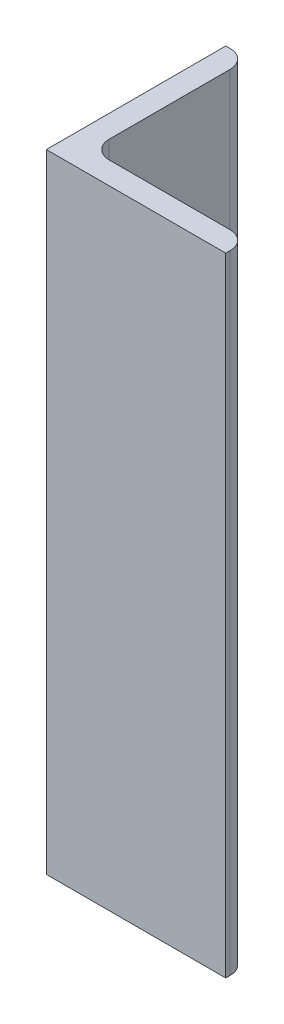
ISO-10303-21;
HEADER;
FILE_DESCRIPTION(('STEP AP214'),'2;1');
FILE_NAME('part.step','',(''),(''),'','','');
FILE_SCHEMA(('AUTOMOTIVE_DESIGN { 1 0 10303 214 1 1 1 1 }'));
ENDSEC;
DATA;
#1=APPLICATION_CONTEXT('core data for automotive mechanical design processes');
#2=APPLICATION_PROTOCOL_DEFINITION('international standard','automotive_design',2000,#1);
#3=PRODUCT_CONTEXT('',#1,'mechanical');
#4=PRODUCT('Part','Part','',(#3));
#5=PRODUCT_RELATED_PRODUCT_CATEGORY('part','',(#4));
#6=PRODUCT_DEFINITION_FORMATION('','',#4);
#7=PRODUCT_DEFINITION_CONTEXT('part definition',#1,'design');
#8=PRODUCT_DEFINITION('design','',#6,#7);
#9=PRODUCT_DEFINITION_SHAPE('','',#8);
#10=(LENGTH_UNIT() NAMED_UNIT(*) SI_UNIT(.MILLI.,.METRE.));
#11=(NAMED_UNIT(*) PLANE_ANGLE_UNIT() SI_UNIT($,.RADIAN.));
#12=(NAMED_UNIT(*) SI_UNIT($,.STERADIAN.) SOLID_ANGLE_UNIT());
#13=UNCERTAINTY_MEASURE_WITH_UNIT(LENGTH_MEASURE(1.E-05),#10,'distance_accuracy_value','');
#14=(GEOMETRIC_REPRESENTATION_CONTEXT(3) GLOBAL_UNCERTAINTY_ASSIGNED_CONTEXT((#13)) GLOBAL_UNIT_ASSIGNED_CONTEXT((#10,
#11,#12)) REPRESENTATION_CONTEXT('',''));
#15=CARTESIAN_POINT('',(0.,0.,0.));
#16=DIRECTION('',(0.,0.,1.));
#17=DIRECTION('',(1.,0.,0.));
#18=AXIS2_PLACEMENT_3D('',#15,#16,#17);
#19=CARTESIAN_POINT('',(25.4,88.9,0.));
#20=DIRECTION('',(0.,0.,-1.));
#21=DIRECTION('',(-1.,0.,0.));
#22=AXIS2_PLACEMENT_3D('',#19,#20,#21);
#23=PLANE('',#22);
#24=DIRECTION('',(1.,0.,0.));
#25=VECTOR('',#24,1.);
#26=CARTESIAN_POINT('',(25.4,0.,0.));
#27=LINE('',#26,#25);
#28=CARTESIAN_POINT('',(0.,0.,0.));
#29=VERTEX_POINT('',#28);
#30=CARTESIAN_POINT('',(25.4,0.,0.));
#31=VERTEX_POINT('',#30);
#32=EDGE_CURVE('E164',#29,#31,#27,.T.);
#33=ORIENTED_EDGE('',*,*,#32,.T.);
#34=DIRECTION('',(0.,-1.,0.));
#35=VECTOR('',#34,1.);
#36=CARTESIAN_POINT('',(25.4,88.9,0.));
#37=LINE('',#36,#35);
#38=CARTESIAN_POINT('',(25.4,88.9,0.));
#39=VERTEX_POINT('',#38);
#40=EDGE_CURVE('E11',#39,#31,#37,.T.);
#41=ORIENTED_EDGE('',*,*,#40,.F.);
#42=DIRECTION('',(1.,0.,0.));
#43=VECTOR('',#42,1.);
#44=CARTESIAN_POINT('',(25.4,88.9,0.));
#45=LINE('',#44,#43);
#46=CARTESIAN_POINT('',(0.,88.9,0.));
#47=VERTEX_POINT('',#46);
#48=EDGE_CURVE('E189',#47,#39,#45,.T.);
#49=ORIENTED_EDGE('',*,*,#48,.F.);
#50=DIRECTION('',(0.,-1.,0.));
#51=VECTOR('',#50,1.);
#52=CARTESIAN_POINT('',(0.,88.9,0.));
#53=LINE('',#52,#51);
#54=EDGE_CURVE('E160',#47,#29,#53,.T.);
#55=ORIENTED_EDGE('',*,*,#54,.T.);
#56=EDGE_LOOP('',(#33,#41,#49,#55));
#57=FACE_BOUND('',#56,.T.);
#58=ADVANCED_FACE('F45',(#57),#23,.F.);
#59=CARTESIAN_POINT('',(25.4,88.9,-0.634999999999982));
#60=DIRECTION('',(-1.,0.,0.));
#61=DIRECTION('',(0.,0.,1.));
#62=AXIS2_PLACEMENT_3D('',#59,#60,#61);
#63=PLANE('',#62);
#64=DIRECTION('',(0.,0.,-1.));
#65=VECTOR('',#64,1.);
#66=CARTESIAN_POINT('',(25.4,0.,-0.634999999999982));
#67=LINE('',#66,#65);
#68=CARTESIAN_POINT('',(25.4,0.,-0.634999999999982));
#69=VERTEX_POINT('',#68);
#70=EDGE_CURVE('E168',#31,#69,#67,.T.);
#71=ORIENTED_EDGE('',*,*,#70,.T.);
#72=DIRECTION('',(0.,-1.,0.));
#73=VECTOR('',#72,1.);
#74=CARTESIAN_POINT('',(25.4,88.9,-0.634999999999982));
#75=LINE('',#74,#73);
#76=CARTESIAN_POINT('',(25.4,88.9,-0.634999999999982));
#77=VERTEX_POINT('',#76);
#78=EDGE_CURVE('E54',#77,#69,#75,.T.);
#79=ORIENTED_EDGE('',*,*,#78,.F.);
#80=DIRECTION('',(0.,0.,-1.));
#81=VECTOR('',#80,1.);
#82=CARTESIAN_POINT('',(25.4,88.9,-0.634999999999982));
#83=LINE('',#82,#81);
#84=EDGE_CURVE('E122',#39,#77,#83,.T.);
#85=ORIENTED_EDGE('',*,*,#84,.F.);
#86=ORIENTED_EDGE('',*,*,#40,.T.);
#87=EDGE_LOOP('',(#71,#79,#85,#86));
#88=FACE_BOUND('',#87,.T.);
#89=ADVANCED_FACE('F245',(#88),#63,.F.);
#90=CARTESIAN_POINT('',(22.86,88.9,-0.635));
#91=DIRECTION('',(0.,-1.,0.));
#92=DIRECTION('',(0.,0.,-1.));
#93=AXIS2_PLACEMENT_3D('',#90,#91,#92);
#94=CYLINDRICAL_SURFACE('',#93,2.54);
#95=CARTESIAN_POINT('',(22.86,0.,-0.635));
#96=DIRECTION('',(0.,1.,0.));
#97=DIRECTION('',(0.,0.,-1.));
#98=AXIS2_PLACEMENT_3D('',#95,#96,#97);
#99=CIRCLE('',#98,2.54);
#100=CARTESIAN_POINT('',(22.86,0.,-3.175));
#101=VERTEX_POINT('',#100);
#102=EDGE_CURVE('E171',#69,#101,#99,.T.);
#103=ORIENTED_EDGE('',*,*,#102,.T.);
#104=DIRECTION('',(0.,-1.,0.));
#105=VECTOR('',#104,1.);
#106=CARTESIAN_POINT('',(22.86,88.9,-3.175));
#107=LINE('',#106,#105);
#108=CARTESIAN_POINT('',(22.86,88.9,-3.175));
#109=VERTEX_POINT('',#108);
#110=EDGE_CURVE('E204',#109,#101,#107,.T.);
#111=ORIENTED_EDGE('',*,*,#110,.F.);
#112=CARTESIAN_POINT('',(22.86,88.9,-0.635));
#113=DIRECTION('',(0.,1.,0.));
#114=DIRECTION('',(0.,0.,-1.));
#115=AXIS2_PLACEMENT_3D('',#112,#113,#114);
#116=CIRCLE('',#115,2.54);
#117=EDGE_CURVE('E214',#77,#109,#116,.T.);
#118=ORIENTED_EDGE('',*,*,#117,.F.);
#119=ORIENTED_EDGE('',*,*,#78,.T.);
#120=EDGE_LOOP('',(#103,#111,#118,#119));
#121=FACE_BOUND('',#120,.T.);
#122=ADVANCED_FACE('F212',(#121),#94,.T.);
#123=CARTESIAN_POINT('',(5.71500000000002,88.9,-3.175));
#124=DIRECTION('',(0.,0.,1.));
#125=DIRECTION('',(1.,0.,0.));
#126=AXIS2_PLACEMENT_3D('',#123,#124,#125);
#127=PLANE('',#126);
#128=DIRECTION('',(-1.,0.,0.));
#129=VECTOR('',#128,1.);
#130=CARTESIAN_POINT('',(5.71500000000002,0.,-3.175));
#131=LINE('',#130,#129);
#132=CARTESIAN_POINT('',(5.71500000000002,0.,-3.175));
#133=VERTEX_POINT('',#132);
#134=EDGE_CURVE('E174',#101,#133,#131,.T.);
#135=ORIENTED_EDGE('',*,*,#134,.T.);
#136=DIRECTION('',(0.,-1.,0.));
#137=VECTOR('',#136,1.);
#138=CARTESIAN_POINT('',(5.71500000000002,88.9,-3.175));
#139=LINE('',#138,#137);
#140=CARTESIAN_POINT('',(5.71500000000002,88.9,-3.175));
#141=VERTEX_POINT('',#140);
#142=EDGE_CURVE('E200',#141,#133,#139,.T.);
#143=ORIENTED_EDGE('',*,*,#142,.F.);
#144=DIRECTION('',(-1.,0.,0.));
#145=VECTOR('',#144,1.);
#146=CARTESIAN_POINT('',(5.71500000000002,88.9,-3.175));
#147=LINE('',#146,#145);
#148=EDGE_CURVE('E231',#109,#141,#147,.T.);
#149=ORIENTED_EDGE('',*,*,#148,.F.);
#150=ORIENTED_EDGE('',*,*,#110,.T.);
#151=EDGE_LOOP('',(#135,#143,#149,#150));
#152=FACE_BOUND('',#151,.T.);
#153=ADVANCED_FACE('F223',(#152),#127,.F.);
#154=CARTESIAN_POINT('',(5.715,88.9,-5.715));
#155=DIRECTION('',(0.,-1.,0.));
#156=DIRECTION('',(0.,0.,-1.));
#157=AXIS2_PLACEMENT_3D('',#154,#155,#156);
#158=CYLINDRICAL_SURFACE('',#157,2.54);
#159=CARTESIAN_POINT('',(5.715,0.,-5.715));
#160=DIRECTION('',(0.,-1.,0.));
#161=DIRECTION('',(0.,0.,1.));
#162=AXIS2_PLACEMENT_3D('',#159,#160,#161);
#163=CIRCLE('',#162,2.54);
#164=CARTESIAN_POINT('',(3.175,0.,-5.71500000000002));
#165=VERTEX_POINT('',#164);
#166=EDGE_CURVE('E177',#133,#165,#163,.T.);
#167=ORIENTED_EDGE('',*,*,#166,.T.);
#168=DIRECTION('',(0.,-1.,0.));
#169=VECTOR('',#168,1.);
#170=CARTESIAN_POINT('',(3.175,88.9,-5.71500000000002));
#171=LINE('',#170,#169);
#172=CARTESIAN_POINT('',(3.175,88.9,-5.71500000000002));
#173=VERTEX_POINT('',#172);
#174=EDGE_CURVE('E196',#173,#165,#171,.T.);
#175=ORIENTED_EDGE('',*,*,#174,.F.);
#176=CARTESIAN_POINT('',(5.715,88.9,-5.715));
#177=DIRECTION('',(0.,-1.,0.));
#178=DIRECTION('',(0.,0.,1.));
#179=AXIS2_PLACEMENT_3D('',#176,#177,#178);
#180=CIRCLE('',#179,2.54);
#181=EDGE_CURVE('E229',#141,#173,#180,.T.);
#182=ORIENTED_EDGE('',*,*,#181,.F.);
#183=ORIENTED_EDGE('',*,*,#142,.T.);
#184=EDGE_LOOP('',(#167,#175,#182,#183));
#185=FACE_BOUND('',#184,.T.);
#186=ADVANCED_FACE('F227',(#185),#158,.F.);
#187=CARTESIAN_POINT('',(3.175,88.9,-22.86));
#188=DIRECTION('',(-1.,0.,0.));
#189=DIRECTION('',(0.,0.,1.));
#190=AXIS2_PLACEMENT_3D('',#187,#188,#189);
#191=PLANE('',#190);
#192=DIRECTION('',(0.,0.,-1.));
#193=VECTOR('',#192,1.);
#194=CARTESIAN_POINT('',(3.175,0.,-22.86));
#195=LINE('',#194,#193);
#196=CARTESIAN_POINT('',(3.175,0.,-22.86));
#197=VERTEX_POINT('',#196);
#198=EDGE_CURVE('E180',#165,#197,#195,.T.);
#199=ORIENTED_EDGE('',*,*,#198,.T.);
#200=DIRECTION('',(0.,-1.,0.));
#201=VECTOR('',#200,1.);
#202=CARTESIAN_POINT('',(3.175,88.9,-22.86));
#203=LINE('',#202,#201);
#204=CARTESIAN_POINT('',(3.175,88.9,-22.86));
#205=VERTEX_POINT('',#204);
#206=EDGE_CURVE('E154',#205,#197,#203,.T.);
#207=ORIENTED_EDGE('',*,*,#206,.F.);
#208=DIRECTION('',(0.,0.,-1.));
#209=VECTOR('',#208,1.);
#210=CARTESIAN_POINT('',(3.175,88.9,-22.86));
#211=LINE('',#210,#209);
#212=EDGE_CURVE('E144',#173,#205,#211,.T.);
#213=ORIENTED_EDGE('',*,*,#212,.F.);
#214=ORIENTED_EDGE('',*,*,#174,.T.);
#215=EDGE_LOOP('',(#199,#207,#213,#214));
#216=FACE_BOUND('',#215,.T.);
#217=ADVANCED_FACE('F257',(#216),#191,.F.);
#218=CARTESIAN_POINT('',(0.635,88.9,-22.86));
#219=DIRECTION('',(0.,-1.,0.));
#220=DIRECTION('',(0.,0.,-1.));
#221=AXIS2_PLACEMENT_3D('',#218,#219,#220);
#222=CYLINDRICAL_SURFACE('',#221,2.54);
#223=CARTESIAN_POINT('',(0.635,0.,-22.86));
#224=DIRECTION('',(0.,1.,0.));
#225=DIRECTION('',(0.,0.,-1.));
#226=AXIS2_PLACEMENT_3D('',#223,#224,#225);
#227=CIRCLE('',#226,2.54);
#228=CARTESIAN_POINT('',(0.634999999999982,0.,-25.4));
#229=VERTEX_POINT('',#228);
#230=EDGE_CURVE('E152',#197,#229,#227,.T.);
#231=ORIENTED_EDGE('',*,*,#230,.T.);
#232=DIRECTION('',(0.,-1.,0.));
#233=VECTOR('',#232,1.);
#234=CARTESIAN_POINT('',(0.634999999999982,88.9,-25.4));
#235=LINE('',#234,#233);
#236=CARTESIAN_POINT('',(0.634999999999982,88.9,-25.4));
#237=VERTEX_POINT('',#236);
#238=EDGE_CURVE('E149',#237,#229,#235,.T.);
#239=ORIENTED_EDGE('',*,*,#238,.F.);
#240=CARTESIAN_POINT('',(0.635,88.9,-22.86));
#241=DIRECTION('',(0.,1.,0.));
#242=DIRECTION('',(0.,0.,-1.));
#243=AXIS2_PLACEMENT_3D('',#240,#241,#242);
#244=CIRCLE('',#243,2.54);
#245=EDGE_CURVE('E138',#205,#237,#244,.T.);
#246=ORIENTED_EDGE('',*,*,#245,.F.);
#247=ORIENTED_EDGE('',*,*,#206,.T.);
#248=EDGE_LOOP('',(#231,#239,#246,#247));
#249=FACE_BOUND('',#248,.T.);
#250=ADVANCED_FACE('F150',(#249),#222,.T.);
#251=CARTESIAN_POINT('',(0.,88.9,-25.4));
#252=DIRECTION('',(0.,0.,1.));
#253=DIRECTION('',(1.,0.,0.));
#254=AXIS2_PLACEMENT_3D('',#251,#252,#253);
#255=PLANE('',#254);
#256=DIRECTION('',(-1.,0.,0.));
#257=VECTOR('',#256,1.);
#258=CARTESIAN_POINT('',(0.,0.,-25.4));
#259=LINE('',#258,#257);
#260=CARTESIAN_POINT('',(0.,0.,-25.4));
#261=VERTEX_POINT('',#260);
#262=EDGE_CURVE('E105',#229,#261,#259,.T.);
#263=ORIENTED_EDGE('',*,*,#262,.T.);
#264=DIRECTION('',(0.,-1.,0.));
#265=VECTOR('',#264,1.);
#266=CARTESIAN_POINT('',(0.,88.9,-25.4));
#267=LINE('',#266,#265);
#268=CARTESIAN_POINT('',(0.,88.9,-25.4));
#269=VERTEX_POINT('',#268);
#270=EDGE_CURVE('E155',#269,#261,#267,.T.);
#271=ORIENTED_EDGE('',*,*,#270,.F.);
#272=DIRECTION('',(-1.,0.,0.));
#273=VECTOR('',#272,1.);
#274=CARTESIAN_POINT('',(0.,88.9,-25.4));
#275=LINE('',#274,#273);
#276=EDGE_CURVE('E142',#237,#269,#275,.T.);
#277=ORIENTED_EDGE('',*,*,#276,.F.);
#278=ORIENTED_EDGE('',*,*,#238,.T.);
#279=EDGE_LOOP('',(#263,#271,#277,#278));
#280=FACE_BOUND('',#279,.T.);
#281=ADVANCED_FACE('F157',(#280),#255,.F.);
#282=CARTESIAN_POINT('',(0.,88.9,0.));
#283=DIRECTION('',(1.,0.,0.));
#284=DIRECTION('',(0.,0.,-1.));
#285=AXIS2_PLACEMENT_3D('',#282,#283,#284);
#286=PLANE('',#285);
#287=DIRECTION('',(0.,0.,1.));
#288=VECTOR('',#287,1.);
#289=CARTESIAN_POINT('',(0.,0.,0.));
#290=LINE('',#289,#288);
#291=EDGE_CURVE('E111',#261,#29,#290,.T.);
#292=ORIENTED_EDGE('',*,*,#291,.T.);
#293=ORIENTED_EDGE('',*,*,#54,.F.);
#294=DIRECTION('',(0.,0.,1.));
#295=VECTOR('',#294,1.);
#296=CARTESIAN_POINT('',(0.,88.9,0.));
#297=LINE('',#296,#295);
#298=EDGE_CURVE('E65',#269,#47,#297,.T.);
#299=ORIENTED_EDGE('',*,*,#298,.F.);
#300=ORIENTED_EDGE('',*,*,#270,.T.);
#301=EDGE_LOOP('',(#292,#293,#299,#300));
#302=FACE_BOUND('',#301,.T.);
#303=ADVANCED_FACE('F265',(#302),#286,.F.);
#304=CARTESIAN_POINT('',(0.635,88.9,-22.86));
#305=DIRECTION('',(0.,-1.,0.));
#306=DIRECTION('',(0.,0.,-1.));
#307=AXIS2_PLACEMENT_3D('',#304,#305,#306);
#308=PLANE('',#307);
#309=ORIENTED_EDGE('',*,*,#48,.T.);
#310=ORIENTED_EDGE('',*,*,#84,.T.);
#311=ORIENTED_EDGE('',*,*,#117,.T.);
#312=ORIENTED_EDGE('',*,*,#148,.T.);
#313=ORIENTED_EDGE('',*,*,#181,.T.);
#314=ORIENTED_EDGE('',*,*,#212,.T.);
#315=ORIENTED_EDGE('',*,*,#245,.T.);
#316=ORIENTED_EDGE('',*,*,#276,.T.);
#317=ORIENTED_EDGE('',*,*,#298,.T.);
#318=EDGE_LOOP('',(#309,#310,#311,#312,#313,#314,#315,#316,#317));
#319=FACE_BOUND('',#318,.T.);
#320=ADVANCED_FACE('F140',(#319),#308,.F.);
#321=CARTESIAN_POINT('',(0.635,0.,-22.86));
#322=DIRECTION('',(0.,-1.,0.));
#323=DIRECTION('',(0.,0.,-1.));
#324=AXIS2_PLACEMENT_3D('',#321,#322,#323);
#325=PLANE('',#324);
#326=ORIENTED_EDGE('',*,*,#32,.F.);
#327=ORIENTED_EDGE('',*,*,#291,.F.);
#328=ORIENTED_EDGE('',*,*,#262,.F.);
#329=ORIENTED_EDGE('',*,*,#230,.F.);
#330=ORIENTED_EDGE('',*,*,#198,.F.);
#331=ORIENTED_EDGE('',*,*,#166,.F.);
#332=ORIENTED_EDGE('',*,*,#134,.F.);
#333=ORIENTED_EDGE('',*,*,#102,.F.);
#334=ORIENTED_EDGE('',*,*,#70,.F.);
#335=EDGE_LOOP('',(#326,#327,#328,#329,#330,#331,#332,#333,#334));
#336=FACE_BOUND('',#335,.T.);
#337=ADVANCED_FACE('F218',(#336),#325,.T.);
#338=CLOSED_SHELL('',(#58,#89,#122,#153,#186,#217,#250,#281,#303,#320,#337));
#339=MANIFOLD_SOLID_BREP('B2',#338);
#340=ADVANCED_BREP_SHAPE_REPRESENTATION('',(#18,#339),#14);
#341=SHAPE_DEFINITION_REPRESENTATION(#9,#340);
ENDSEC;
END-ISO-10303-21;
